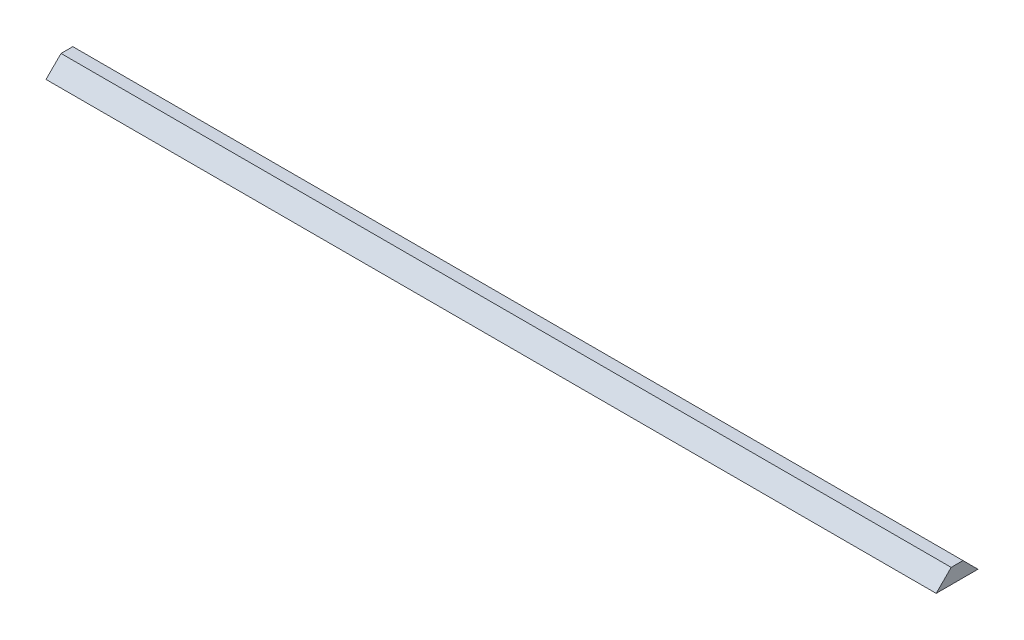
ISO-10303-21;
HEADER;
FILE_DESCRIPTION(('STEP AP214'),'2;1');
FILE_NAME('part.step','',(''),(''),'','','');
FILE_SCHEMA(('AUTOMOTIVE_DESIGN { 1 0 10303 214 1 1 1 1 }'));
ENDSEC;
DATA;
#1=APPLICATION_CONTEXT('core data for automotive mechanical design processes');
#2=APPLICATION_PROTOCOL_DEFINITION('international standard','automotive_design',2000,#1);
#3=PRODUCT_CONTEXT('',#1,'mechanical');
#4=PRODUCT('Part','Part','',(#3));
#5=PRODUCT_RELATED_PRODUCT_CATEGORY('part','',(#4));
#6=PRODUCT_DEFINITION_FORMATION('','',#4);
#7=PRODUCT_DEFINITION_CONTEXT('part definition',#1,'design');
#8=PRODUCT_DEFINITION('design','',#6,#7);
#9=PRODUCT_DEFINITION_SHAPE('','',#8);
#10=(LENGTH_UNIT() NAMED_UNIT(*) SI_UNIT(.MILLI.,.METRE.));
#11=(NAMED_UNIT(*) PLANE_ANGLE_UNIT() SI_UNIT($,.RADIAN.));
#12=(NAMED_UNIT(*) SI_UNIT($,.STERADIAN.) SOLID_ANGLE_UNIT());
#13=UNCERTAINTY_MEASURE_WITH_UNIT(LENGTH_MEASURE(1.E-05),#10,'distance_accuracy_value','');
#14=(GEOMETRIC_REPRESENTATION_CONTEXT(3) GLOBAL_UNCERTAINTY_ASSIGNED_CONTEXT((#13)) GLOBAL_UNIT_ASSIGNED_CONTEXT((#10,
#11,#12)) REPRESENTATION_CONTEXT('',''));
#15=CARTESIAN_POINT('',(0.,0.,0.));
#16=DIRECTION('',(0.,0.,1.));
#17=DIRECTION('',(1.,0.,0.));
#18=AXIS2_PLACEMENT_3D('',#15,#16,#17);
#19=CARTESIAN_POINT('',(83.,1.4,0.549999999999985));
#20=DIRECTION('',(0.,-1.,0.));
#21=DIRECTION('',(0.,0.,-1.));
#22=AXIS2_PLACEMENT_3D('',#19,#20,#21);
#23=PLANE('',#22);
#24=DIRECTION('',(0.,0.,1.));
#25=VECTOR('',#24,1.);
#26=CARTESIAN_POINT('',(0.,1.4,0.549999999999985));
#27=LINE('',#26,#25);
#28=CARTESIAN_POINT('',(0.,1.4,-0.549999999999985));
#29=VERTEX_POINT('',#28);
#30=CARTESIAN_POINT('',(0.,1.4,0.549999999999985));
#31=VERTEX_POINT('',#30);
#32=EDGE_CURVE('E107',#29,#31,#27,.T.);
#33=ORIENTED_EDGE('',*,*,#32,.T.);
#34=DIRECTION('',(-1.,0.,0.));
#35=VECTOR('',#34,1.);
#36=CARTESIAN_POINT('',(83.,1.4,0.549999999999985));
#37=LINE('',#36,#35);
#38=CARTESIAN_POINT('',(83.,1.4,0.549999999999985));
#39=VERTEX_POINT('',#38);
#40=EDGE_CURVE('E11',#39,#31,#37,.T.);
#41=ORIENTED_EDGE('',*,*,#40,.F.);
#42=DIRECTION('',(0.,0.,1.));
#43=VECTOR('',#42,1.);
#44=CARTESIAN_POINT('',(83.,1.4,0.549999999999985));
#45=LINE('',#44,#43);
#46=CARTESIAN_POINT('',(83.,1.4,-0.549999999999985));
#47=VERTEX_POINT('',#46);
#48=EDGE_CURVE('E91',#47,#39,#45,.T.);
#49=ORIENTED_EDGE('',*,*,#48,.F.);
#50=DIRECTION('',(-1.,0.,0.));
#51=VECTOR('',#50,1.);
#52=CARTESIAN_POINT('',(83.,1.4,-0.549999999999985));
#53=LINE('',#52,#51);
#54=EDGE_CURVE('E103',#47,#29,#53,.T.);
#55=ORIENTED_EDGE('',*,*,#54,.T.);
#56=EDGE_LOOP('',(#33,#41,#49,#55));
#57=FACE_BOUND('',#56,.T.);
#58=ADVANCED_FACE('F39',(#57),#23,.F.);
#59=CARTESIAN_POINT('',(83.,0.,1.95));
#60=DIRECTION('',(0.,-0.707106781186551,-0.707106781186544));
#61=DIRECTION('',(0.,0.707106781186544,-0.707106781186551));
#62=AXIS2_PLACEMENT_3D('',#59,#60,#61);
#63=PLANE('',#62);
#64=DIRECTION('',(0.,-0.707106781186544,0.707106781186551));
#65=VECTOR('',#64,1.);
#66=CARTESIAN_POINT('',(0.,0.,1.95));
#67=LINE('',#66,#65);
#68=CARTESIAN_POINT('',(0.,0.,1.95));
#69=VERTEX_POINT('',#68);
#70=EDGE_CURVE('E96',#31,#69,#67,.T.);
#71=ORIENTED_EDGE('',*,*,#70,.T.);
#72=DIRECTION('',(-1.,0.,0.));
#73=VECTOR('',#72,1.);
#74=CARTESIAN_POINT('',(83.,0.,1.95));
#75=LINE('',#74,#73);
#76=CARTESIAN_POINT('',(83.,0.,1.95));
#77=VERTEX_POINT('',#76);
#78=EDGE_CURVE('E48',#77,#69,#75,.T.);
#79=ORIENTED_EDGE('',*,*,#78,.F.);
#80=DIRECTION('',(0.,-0.707106781186544,0.707106781186551));
#81=VECTOR('',#80,1.);
#82=CARTESIAN_POINT('',(83.,0.,1.95));
#83=LINE('',#82,#81);
#84=EDGE_CURVE('E86',#39,#77,#83,.T.);
#85=ORIENTED_EDGE('',*,*,#84,.F.);
#86=ORIENTED_EDGE('',*,*,#40,.T.);
#87=EDGE_LOOP('',(#71,#79,#85,#86));
#88=FACE_BOUND('',#87,.T.);
#89=ADVANCED_FACE('F95',(#88),#63,.F.);
#90=CARTESIAN_POINT('',(83.,0.,-1.95));
#91=DIRECTION('',(0.,1.,0.));
#92=DIRECTION('',(0.,0.,1.));
#93=AXIS2_PLACEMENT_3D('',#90,#91,#92);
#94=PLANE('',#93);
#95=DIRECTION('',(0.,0.,-1.));
#96=VECTOR('',#95,1.);
#97=CARTESIAN_POINT('',(0.,0.,-1.95));
#98=LINE('',#97,#96);
#99=CARTESIAN_POINT('',(0.,0.,-1.95));
#100=VERTEX_POINT('',#99);
#101=EDGE_CURVE('E73',#69,#100,#98,.T.);
#102=ORIENTED_EDGE('',*,*,#101,.T.);
#103=DIRECTION('',(-1.,0.,0.));
#104=VECTOR('',#103,1.);
#105=CARTESIAN_POINT('',(83.,0.,-1.95));
#106=LINE('',#105,#104);
#107=CARTESIAN_POINT('',(83.,0.,-1.95));
#108=VERTEX_POINT('',#107);
#109=EDGE_CURVE('E98',#108,#100,#106,.T.);
#110=ORIENTED_EDGE('',*,*,#109,.F.);
#111=DIRECTION('',(0.,0.,-1.));
#112=VECTOR('',#111,1.);
#113=CARTESIAN_POINT('',(83.,0.,-1.95));
#114=LINE('',#113,#112);
#115=EDGE_CURVE('E89',#77,#108,#114,.T.);
#116=ORIENTED_EDGE('',*,*,#115,.F.);
#117=ORIENTED_EDGE('',*,*,#78,.T.);
#118=EDGE_LOOP('',(#102,#110,#116,#117));
#119=FACE_BOUND('',#118,.T.);
#120=ADVANCED_FACE('F99',(#119),#94,.F.);
#121=CARTESIAN_POINT('',(83.,0.,-1.95));
#122=DIRECTION('',(0.,-0.707106781186551,0.707106781186544));
#123=DIRECTION('',(0.,-0.707106781186544,-0.707106781186551));
#124=AXIS2_PLACEMENT_3D('',#121,#122,#123);
#125=PLANE('',#124);
#126=DIRECTION('',(0.,0.707106781186544,0.707106781186551));
#127=VECTOR('',#126,1.);
#128=CARTESIAN_POINT('',(0.,0.,-1.95));
#129=LINE('',#128,#127);
#130=EDGE_CURVE('E79',#100,#29,#129,.T.);
#131=ORIENTED_EDGE('',*,*,#130,.T.);
#132=ORIENTED_EDGE('',*,*,#54,.F.);
#133=DIRECTION('',(0.,0.707106781186544,0.707106781186551));
#134=VECTOR('',#133,1.);
#135=CARTESIAN_POINT('',(83.,0.,-1.95));
#136=LINE('',#135,#134);
#137=EDGE_CURVE('E56',#108,#47,#136,.T.);
#138=ORIENTED_EDGE('',*,*,#137,.F.);
#139=ORIENTED_EDGE('',*,*,#109,.T.);
#140=EDGE_LOOP('',(#131,#132,#138,#139));
#141=FACE_BOUND('',#140,.T.);
#142=ADVANCED_FACE('F120',(#141),#125,.F.);
#143=CARTESIAN_POINT('',(83.,0.,0.));
#144=DIRECTION('',(1.,0.,0.));
#145=DIRECTION('',(0.,0.,-1.));
#146=AXIS2_PLACEMENT_3D('',#143,#144,#145);
#147=PLANE('',#146);
#148=ORIENTED_EDGE('',*,*,#48,.T.);
#149=ORIENTED_EDGE('',*,*,#84,.T.);
#150=ORIENTED_EDGE('',*,*,#115,.T.);
#151=ORIENTED_EDGE('',*,*,#137,.T.);
#152=EDGE_LOOP('',(#148,#149,#150,#151));
#153=FACE_BOUND('',#152,.T.);
#154=ADVANCED_FACE('F87',(#153),#147,.T.);
#155=CARTESIAN_POINT('',(0.,0.,0.));
#156=DIRECTION('',(1.,0.,0.));
#157=DIRECTION('',(0.,0.,-1.));
#158=AXIS2_PLACEMENT_3D('',#155,#156,#157);
#159=PLANE('',#158);
#160=ORIENTED_EDGE('',*,*,#32,.F.);
#161=ORIENTED_EDGE('',*,*,#130,.F.);
#162=ORIENTED_EDGE('',*,*,#101,.F.);
#163=ORIENTED_EDGE('',*,*,#70,.F.);
#164=EDGE_LOOP('',(#160,#161,#162,#163));
#165=FACE_BOUND('',#164,.T.);
#166=ADVANCED_FACE('F123',(#165),#159,.F.);
#167=CLOSED_SHELL('',(#58,#89,#120,#142,#154,#166));
#168=MANIFOLD_SOLID_BREP('B2',#167);
#169=ADVANCED_BREP_SHAPE_REPRESENTATION('',(#18,#168),#14);
#170=SHAPE_DEFINITION_REPRESENTATION(#9,#169);
ENDSEC;
END-ISO-10303-21;
